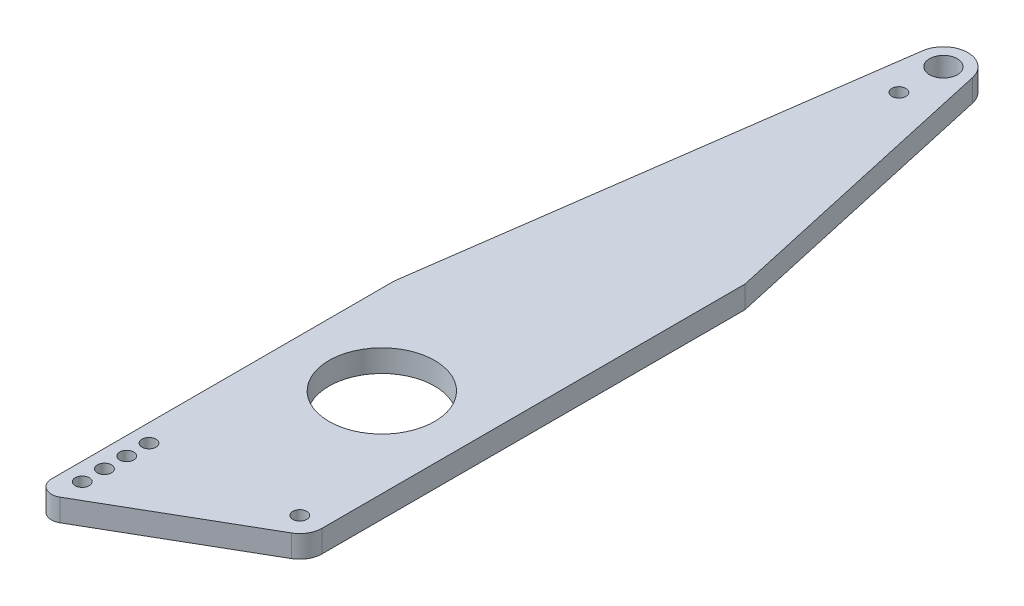
ISO-10303-21;
HEADER;
FILE_DESCRIPTION(('STEP AP214'),'2;1');
FILE_NAME('part.step','',(''),(''),'','','');
FILE_SCHEMA(('AUTOMOTIVE_DESIGN { 1 0 10303 214 1 1 1 1 }'));
ENDSEC;
DATA;
#1=APPLICATION_CONTEXT('core data for automotive mechanical design processes');
#2=APPLICATION_PROTOCOL_DEFINITION('international standard','automotive_design',2000,#1);
#3=PRODUCT_CONTEXT('',#1,'mechanical');
#4=PRODUCT('Part','Part','',(#3));
#5=PRODUCT_RELATED_PRODUCT_CATEGORY('part','',(#4));
#6=PRODUCT_DEFINITION_FORMATION('','',#4);
#7=PRODUCT_DEFINITION_CONTEXT('part definition',#1,'design');
#8=PRODUCT_DEFINITION('design','',#6,#7);
#9=PRODUCT_DEFINITION_SHAPE('','',#8);
#10=(LENGTH_UNIT() NAMED_UNIT(*) SI_UNIT(.MILLI.,.METRE.));
#11=(NAMED_UNIT(*) PLANE_ANGLE_UNIT() SI_UNIT($,.RADIAN.));
#12=(NAMED_UNIT(*) SI_UNIT($,.STERADIAN.) SOLID_ANGLE_UNIT());
#13=UNCERTAINTY_MEASURE_WITH_UNIT(LENGTH_MEASURE(1.E-05),#10,'distance_accuracy_value','');
#14=(GEOMETRIC_REPRESENTATION_CONTEXT(3) GLOBAL_UNCERTAINTY_ASSIGNED_CONTEXT((#13)) GLOBAL_UNIT_ASSIGNED_CONTEXT((#10,
#11,#12)) REPRESENTATION_CONTEXT('',''));
#15=CARTESIAN_POINT('',(0.,0.,0.));
#16=DIRECTION('',(0.,0.,1.));
#17=DIRECTION('',(1.,0.,0.));
#18=AXIS2_PLACEMENT_3D('',#15,#16,#17);
#19=CARTESIAN_POINT('',(-25.4,-6.35,229.105280097995));
#20=DIRECTION('',(-1.,0.,0.));
#21=DIRECTION('',(0.,0.,1.));
#22=AXIS2_PLACEMENT_3D('',#19,#20,#21);
#23=PLANE('',#22);
#24=DIRECTION('',(0.,0.,1.));
#25=VECTOR('',#24,1.);
#26=CARTESIAN_POINT('',(-25.4,-6.35,229.105280097995));
#27=LINE('',#26,#25);
#28=CARTESIAN_POINT('',(-25.4,-6.35,131.27869109805));
#29=VERTEX_POINT('',#28);
#30=CARTESIAN_POINT('',(-25.4,-6.35,197.355280097995));
#31=VERTEX_POINT('',#30);
#32=EDGE_CURVE('E128',#29,#31,#27,.T.);
#33=ORIENTED_EDGE('',*,*,#32,.T.);
#34=DIRECTION('',(0.,1.,0.));
#35=VECTOR('',#34,1.);
#36=CARTESIAN_POINT('',(-25.4,-6.35,197.355280097995));
#37=LINE('',#36,#35);
#38=CARTESIAN_POINT('',(-25.4,0.,197.355280097995));
#39=VERTEX_POINT('',#38);
#40=EDGE_CURVE('E11',#31,#39,#37,.T.);
#41=ORIENTED_EDGE('',*,*,#40,.T.);
#42=DIRECTION('',(0.,0.,1.));
#43=VECTOR('',#42,1.);
#44=CARTESIAN_POINT('',(-25.4,0.,229.105280097995));
#45=LINE('',#44,#43);
#46=CARTESIAN_POINT('',(-25.4,0.,131.27869109805));
#47=VERTEX_POINT('',#46);
#48=EDGE_CURVE('E159',#47,#39,#45,.T.);
#49=ORIENTED_EDGE('',*,*,#48,.F.);
#50=DIRECTION('',(0.,1.,0.));
#51=VECTOR('',#50,1.);
#52=CARTESIAN_POINT('',(-25.4,-6.35,131.27869109805));
#53=LINE('',#52,#51);
#54=EDGE_CURVE('E119',#29,#47,#53,.T.);
#55=ORIENTED_EDGE('',*,*,#54,.F.);
#56=EDGE_LOOP('',(#33,#41,#49,#55));
#57=FACE_BOUND('',#56,.T.);
#58=ADVANCED_FACE('F40',(#57),#23,.T.);
#59=CARTESIAN_POINT('',(-2.73922878190387E-13,-6.35,0.));
#60=DIRECTION('',(0.,1.,0.));
#61=DIRECTION('',(0.,0.,1.));
#62=AXIS2_PLACEMENT_3D('',#59,#60,#61);
#63=CYLINDRICAL_SURFACE('',#62,6.985);
#64=CARTESIAN_POINT('',(-2.73922878190387E-13,0.,0.));
#65=DIRECTION('',(0.,1.,0.));
#66=DIRECTION('',(0.,0.,1.));
#67=AXIS2_PLACEMENT_3D('',#64,#65,#66);
#68=CIRCLE('',#67,6.985);
#69=CARTESIAN_POINT('',(6.81842619825207,0.,-1.51634071995371));
#70=VERTEX_POINT('',#69);
#71=CARTESIAN_POINT('',(-6.9177677348346,0.,-0.966806375072736));
#72=VERTEX_POINT('',#71);
#73=EDGE_CURVE('E154',#70,#72,#68,.T.);
#74=ORIENTED_EDGE('',*,*,#73,.F.);
#75=DIRECTION('',(0.,1.,0.));
#76=VECTOR('',#75,1.);
#77=CARTESIAN_POINT('',(6.81842619825207,-6.35,-1.51634071995371));
#78=LINE('',#77,#76);
#79=CARTESIAN_POINT('',(6.81842619825207,-6.35,-1.51634071995371));
#80=VERTEX_POINT('',#79);
#81=EDGE_CURVE('E49',#80,#70,#78,.T.);
#82=ORIENTED_EDGE('',*,*,#81,.F.);
#83=CARTESIAN_POINT('',(-2.73922878190387E-13,-6.35,0.));
#84=DIRECTION('',(0.,1.,0.));
#85=DIRECTION('',(0.,0.,1.));
#86=AXIS2_PLACEMENT_3D('',#83,#84,#85);
#87=CIRCLE('',#86,6.985);
#88=CARTESIAN_POINT('',(-6.9177677348346,-6.35,-0.966806375072736));
#89=VERTEX_POINT('',#88);
#90=EDGE_CURVE('E126',#80,#89,#87,.T.);
#91=ORIENTED_EDGE('',*,*,#90,.T.);
#92=DIRECTION('',(0.,1.,0.));
#93=VECTOR('',#92,1.);
#94=CARTESIAN_POINT('',(-6.9177677348346,-6.35,-0.966806375072736));
#95=LINE('',#94,#93);
#96=EDGE_CURVE('E109',#89,#72,#95,.T.);
#97=ORIENTED_EDGE('',*,*,#96,.T.);
#98=EDGE_LOOP('',(#74,#82,#91,#97));
#99=FACE_BOUND('',#98,.T.);
#100=ADVANCED_FACE('F42',(#99),#63,.T.);
#101=CARTESIAN_POINT('',(25.4,-6.35,82.0381585738854));
#102=DIRECTION('',(0.976152641124134,0.,-0.2170852856054));
#103=DIRECTION('',(-0.2170852856054,0.,-0.976152641124134));
#104=AXIS2_PLACEMENT_3D('',#101,#102,#103);
#105=PLANE('',#104);
#106=DIRECTION('',(-0.2170852856054,0.,-0.976152641124134));
#107=VECTOR('',#106,1.);
#108=CARTESIAN_POINT('',(25.4,0.,82.0381585738854));
#109=LINE('',#108,#107);
#110=CARTESIAN_POINT('',(25.4,0.,82.0381585738854));
#111=VERTEX_POINT('',#110);
#112=EDGE_CURVE('E131',#111,#70,#109,.T.);
#113=ORIENTED_EDGE('',*,*,#112,.F.);
#114=DIRECTION('',(0.,1.,0.));
#115=VECTOR('',#114,1.);
#116=CARTESIAN_POINT('',(25.4,-6.35,82.0381585738854));
#117=LINE('',#116,#115);
#118=CARTESIAN_POINT('',(25.4,-6.35,82.0381585738854));
#119=VERTEX_POINT('',#118);
#120=EDGE_CURVE('E174',#119,#111,#117,.T.);
#121=ORIENTED_EDGE('',*,*,#120,.F.);
#122=DIRECTION('',(-0.2170852856054,0.,-0.976152641124134));
#123=VECTOR('',#122,1.);
#124=CARTESIAN_POINT('',(25.4,-6.35,82.0381585738854));
#125=LINE('',#124,#123);
#126=EDGE_CURVE('E120',#119,#80,#125,.T.);
#127=ORIENTED_EDGE('',*,*,#126,.T.);
#128=ORIENTED_EDGE('',*,*,#81,.T.);
#129=EDGE_LOOP('',(#113,#121,#127,#128));
#130=FACE_BOUND('',#129,.T.);
#131=ADVANCED_FACE('F190',(#130),#105,.T.);
#132=CARTESIAN_POINT('',(25.4,-6.35,82.0381585738854));
#133=DIRECTION('',(1.,0.,0.));
#134=DIRECTION('',(0.,0.,-1.));
#135=AXIS2_PLACEMENT_3D('',#132,#133,#134);
#136=PLANE('',#135);
#137=DIRECTION('',(0.,0.,-1.));
#138=VECTOR('',#137,1.);
#139=CARTESIAN_POINT('',(25.4,0.,82.0381585738854));
#140=LINE('',#139,#138);
#141=CARTESIAN_POINT('',(25.4,0.,202.708825790646));
#142=VERTEX_POINT('',#141);
#143=EDGE_CURVE('E134',#142,#111,#140,.T.);
#144=ORIENTED_EDGE('',*,*,#143,.F.);
#145=DIRECTION('',(0.,1.,0.));
#146=VECTOR('',#145,1.);
#147=CARTESIAN_POINT('',(25.4,-6.35,202.708825790646));
#148=LINE('',#147,#146);
#149=CARTESIAN_POINT('',(25.4,-6.35,202.708825790646));
#150=VERTEX_POINT('',#149);
#151=EDGE_CURVE('E176',#150,#142,#148,.T.);
#152=ORIENTED_EDGE('',*,*,#151,.F.);
#153=DIRECTION('',(0.,0.,-1.));
#154=VECTOR('',#153,1.);
#155=CARTESIAN_POINT('',(25.4,-6.35,82.0381585738854));
#156=LINE('',#155,#154);
#157=EDGE_CURVE('E150',#150,#119,#156,.T.);
#158=ORIENTED_EDGE('',*,*,#157,.T.);
#159=ORIENTED_EDGE('',*,*,#120,.T.);
#160=EDGE_LOOP('',(#144,#152,#158,#159));
#161=FACE_BOUND('',#160,.T.);
#162=ADVANCED_FACE('F221',(#161),#136,.T.);
#163=CARTESIAN_POINT('',(19.05,-6.35,202.708825790646));
#164=DIRECTION('',(0.,1.,0.));
#165=DIRECTION('',(0.,0.,1.));
#166=AXIS2_PLACEMENT_3D('',#163,#164,#165);
#167=CYLINDRICAL_SURFACE('',#166,6.34999999999999);
#168=CARTESIAN_POINT('',(19.05,0.,202.708825790646));
#169=DIRECTION('',(0.,1.,0.));
#170=DIRECTION('',(0.,0.,-1.));
#171=AXIS2_PLACEMENT_3D('',#168,#169,#170);
#172=CIRCLE('',#171,6.34999999999999);
#173=CARTESIAN_POINT('',(22.225,0.,208.208087104677));
#174=VERTEX_POINT('',#173);
#175=EDGE_CURVE('E168',#174,#142,#172,.T.);
#176=ORIENTED_EDGE('',*,*,#175,.F.);
#177=DIRECTION('',(0.,1.,0.));
#178=VECTOR('',#177,1.);
#179=CARTESIAN_POINT('',(22.225,-6.35,208.208087104677));
#180=LINE('',#179,#178);
#181=CARTESIAN_POINT('',(22.225,-6.35,208.208087104677));
#182=VERTEX_POINT('',#181);
#183=EDGE_CURVE('E178',#182,#174,#180,.T.);
#184=ORIENTED_EDGE('',*,*,#183,.F.);
#185=CARTESIAN_POINT('',(19.05,-6.35,202.708825790646));
#186=DIRECTION('',(0.,1.,0.));
#187=DIRECTION('',(0.,0.,-1.));
#188=AXIS2_PLACEMENT_3D('',#185,#186,#187);
#189=CIRCLE('',#188,6.34999999999999);
#190=EDGE_CURVE('E147',#182,#150,#189,.T.);
#191=ORIENTED_EDGE('',*,*,#190,.T.);
#192=ORIENTED_EDGE('',*,*,#151,.T.);
#193=EDGE_LOOP('',(#176,#184,#191,#192));
#194=FACE_BOUND('',#193,.T.);
#195=ADVANCED_FACE('F197',(#194),#167,.T.);
#196=CARTESIAN_POINT('',(22.225,-6.35,208.208087104677));
#197=DIRECTION('',(0.499999999999997,0.,0.86602540378444));
#198=DIRECTION('',(0.86602540378444,0.,-0.499999999999998));
#199=AXIS2_PLACEMENT_3D('',#196,#197,#198);
#200=PLANE('',#199);
#201=DIRECTION('',(0.86602540378444,0.,-0.499999999999997));
#202=VECTOR('',#201,1.);
#203=CARTESIAN_POINT('',(22.225,0.,208.208087104677));
#204=LINE('',#203,#202);
#205=CARTESIAN_POINT('',(-19.685,0.,232.404836886414));
#206=VERTEX_POINT('',#205);
#207=EDGE_CURVE('E165',#206,#174,#204,.T.);
#208=ORIENTED_EDGE('',*,*,#207,.F.);
#209=DIRECTION('',(0.,1.,0.));
#210=VECTOR('',#209,1.);
#211=CARTESIAN_POINT('',(-19.685,-6.35,232.404836886414));
#212=LINE('',#211,#210);
#213=CARTESIAN_POINT('',(-19.685,-6.35,232.404836886414));
#214=VERTEX_POINT('',#213);
#215=EDGE_CURVE('E180',#214,#206,#212,.T.);
#216=ORIENTED_EDGE('',*,*,#215,.F.);
#217=DIRECTION('',(0.86602540378444,0.,-0.499999999999997));
#218=VECTOR('',#217,1.);
#219=CARTESIAN_POINT('',(22.225,-6.35,208.208087104677));
#220=LINE('',#219,#218);
#221=EDGE_CURVE('E144',#214,#182,#220,.T.);
#222=ORIENTED_EDGE('',*,*,#221,.T.);
#223=ORIENTED_EDGE('',*,*,#183,.T.);
#224=EDGE_LOOP('',(#208,#216,#222,#223));
#225=FACE_BOUND('',#224,.T.);
#226=ADVANCED_FACE('F200',(#225),#200,.T.);
#227=CARTESIAN_POINT('',(-21.59,-6.35,229.105280097995));
#228=DIRECTION('',(0.,1.,0.));
#229=DIRECTION('',(0.,0.,1.));
#230=AXIS2_PLACEMENT_3D('',#227,#228,#229);
#231=CYLINDRICAL_SURFACE('',#230,3.80999999999998);
#232=CARTESIAN_POINT('',(-21.59,0.,229.105280097995));
#233=DIRECTION('',(0.,1.,0.));
#234=DIRECTION('',(0.,0.,1.));
#235=AXIS2_PLACEMENT_3D('',#232,#233,#234);
#236=CIRCLE('',#235,3.80999999999998);
#237=CARTESIAN_POINT('',(-25.4,0.,229.105280097995));
#238=VERTEX_POINT('',#237);
#239=EDGE_CURVE('E162',#238,#206,#236,.T.);
#240=ORIENTED_EDGE('',*,*,#239,.F.);
#241=DIRECTION('',(0.,1.,0.));
#242=VECTOR('',#241,1.);
#243=CARTESIAN_POINT('',(-25.4,-6.35,229.105280097995));
#244=LINE('',#243,#242);
#245=CARTESIAN_POINT('',(-25.4,-6.35,229.105280097995));
#246=VERTEX_POINT('',#245);
#247=EDGE_CURVE('E182',#246,#238,#244,.T.);
#248=ORIENTED_EDGE('',*,*,#247,.F.);
#249=CARTESIAN_POINT('',(-21.59,-6.35,229.105280097995));
#250=DIRECTION('',(0.,1.,0.));
#251=DIRECTION('',(0.,0.,1.));
#252=AXIS2_PLACEMENT_3D('',#249,#250,#251);
#253=CIRCLE('',#252,3.80999999999998);
#254=EDGE_CURVE('E141',#246,#214,#253,.T.);
#255=ORIENTED_EDGE('',*,*,#254,.T.);
#256=ORIENTED_EDGE('',*,*,#215,.T.);
#257=EDGE_LOOP('',(#240,#248,#255,#256));
#258=FACE_BOUND('',#257,.T.);
#259=ADVANCED_FACE('F205',(#258),#231,.T.);
#260=ORIENTED_EDGE('',*,*,#40,.F.);
#261=EDGE_CURVE('E129',#31,#246,#27,.T.);
#262=ORIENTED_EDGE('',*,*,#261,.T.);
#263=ORIENTED_EDGE('',*,*,#247,.T.);
#264=EDGE_CURVE('E158',#39,#238,#45,.T.);
#265=ORIENTED_EDGE('',*,*,#264,.F.);
#266=EDGE_LOOP('',(#260,#262,#263,#265));
#267=FACE_BOUND('',#266,.T.);
#268=ADVANCED_FACE('F206',(#267),#23,.T.);
#269=CARTESIAN_POINT('',(-25.4,-6.35,131.27869109805));
#270=DIRECTION('',(-0.990374765187488,0.,-0.138411793138545));
#271=DIRECTION('',(-0.138411793138545,0.,0.990374765187488));
#272=AXIS2_PLACEMENT_3D('',#269,#270,#271);
#273=PLANE('',#272);
#274=DIRECTION('',(-0.138411793138545,0.,0.990374765187488));
#275=VECTOR('',#274,1.);
#276=CARTESIAN_POINT('',(-25.4,0.,131.27869109805));
#277=LINE('',#276,#275);
#278=EDGE_CURVE('E114',#72,#47,#277,.T.);
#279=ORIENTED_EDGE('',*,*,#278,.F.);
#280=ORIENTED_EDGE('',*,*,#96,.F.);
#281=DIRECTION('',(-0.138411793138545,0.,0.990374765187488));
#282=VECTOR('',#281,1.);
#283=CARTESIAN_POINT('',(-25.4,-6.35,131.27869109805));
#284=LINE('',#283,#282);
#285=EDGE_CURVE('E112',#89,#29,#284,.T.);
#286=ORIENTED_EDGE('',*,*,#285,.T.);
#287=ORIENTED_EDGE('',*,*,#54,.T.);
#288=EDGE_LOOP('',(#279,#280,#286,#287));
#289=FACE_BOUND('',#288,.T.);
#290=ADVANCED_FACE('F111',(#289),#273,.T.);
#291=CARTESIAN_POINT('',(-2.73922878190387E-13,-6.35,0.));
#292=DIRECTION('',(0.,1.,0.));
#293=DIRECTION('',(0.,0.,1.));
#294=AXIS2_PLACEMENT_3D('',#291,#292,#293);
#295=PLANE('',#294);
#296=CARTESIAN_POINT('',(0.,-6.35,12.7));
#297=DIRECTION('',(0.,1.,0.));
#298=DIRECTION('',(0.,0.,1.));
#299=AXIS2_PLACEMENT_3D('',#296,#297,#298);
#300=CIRCLE('',#299,2.00000000000026);
#301=CARTESIAN_POINT('',(0.,-6.35,14.7000000000002));
#302=VERTEX_POINT('',#301);
#303=EDGE_CURVE('E414',#302,#302,#300,.T.);
#304=ORIENTED_EDGE('',*,*,#303,.T.);
#305=EDGE_LOOP('',(#304));
#306=FACE_BOUND('',#305,.T.);
#307=CARTESIAN_POINT('',(19.05,-6.35,202.708825790646));
#308=DIRECTION('',(0.,1.,0.));
#309=DIRECTION('',(0.,0.,1.));
#310=AXIS2_PLACEMENT_3D('',#307,#308,#309);
#311=CIRCLE('',#310,2.);
#312=CARTESIAN_POINT('',(19.05,-6.35,204.708825790646));
#313=VERTEX_POINT('',#312);
#314=EDGE_CURVE('E410',#313,#313,#311,.T.);
#315=ORIENTED_EDGE('',*,*,#314,.T.);
#316=EDGE_LOOP('',(#315));
#317=FACE_BOUND('',#316,.T.);
#318=CARTESIAN_POINT('',(-20.32,-6.35,206.375));
#319=DIRECTION('',(0.,1.,0.));
#320=DIRECTION('',(0.,0.,1.));
#321=AXIS2_PLACEMENT_3D('',#318,#319,#320);
#322=CIRCLE('',#321,2.00000000000023);
#323=CARTESIAN_POINT('',(-20.32,-6.35,208.375));
#324=VERTEX_POINT('',#323);
#325=EDGE_CURVE('E406',#324,#324,#322,.T.);
#326=ORIENTED_EDGE('',*,*,#325,.T.);
#327=EDGE_LOOP('',(#326));
#328=FACE_BOUND('',#327,.T.);
#329=CARTESIAN_POINT('',(-20.32,-6.35,212.725));
#330=DIRECTION('',(0.,1.,0.));
#331=DIRECTION('',(0.,0.,1.));
#332=AXIS2_PLACEMENT_3D('',#329,#330,#331);
#333=CIRCLE('',#332,2.00000000000023);
#334=CARTESIAN_POINT('',(-20.32,-6.35,214.725));
#335=VERTEX_POINT('',#334);
#336=EDGE_CURVE('E402',#335,#335,#333,.T.);
#337=ORIENTED_EDGE('',*,*,#336,.T.);
#338=EDGE_LOOP('',(#337));
#339=FACE_BOUND('',#338,.T.);
#340=CARTESIAN_POINT('',(-20.32,-6.35,225.425));
#341=DIRECTION('',(0.,1.,0.));
#342=DIRECTION('',(0.,0.,1.));
#343=AXIS2_PLACEMENT_3D('',#340,#341,#342);
#344=CIRCLE('',#343,2.00000000000023);
#345=CARTESIAN_POINT('',(-20.32,-6.35,227.425));
#346=VERTEX_POINT('',#345);
#347=EDGE_CURVE('E398',#346,#346,#344,.T.);
#348=ORIENTED_EDGE('',*,*,#347,.T.);
#349=EDGE_LOOP('',(#348));
#350=FACE_BOUND('',#349,.T.);
#351=CARTESIAN_POINT('',(0.,-6.35,160.246508934012));
#352=DIRECTION('',(0.,1.,0.));
#353=DIRECTION('',(0.,0.,1.));
#354=AXIS2_PLACEMENT_3D('',#351,#352,#353);
#355=CIRCLE('',#354,15.0812500000002);
#356=CARTESIAN_POINT('',(0.,-6.35,175.327758934012));
#357=VERTEX_POINT('',#356);
#358=EDGE_CURVE('E394',#357,#357,#355,.T.);
#359=ORIENTED_EDGE('',*,*,#358,.T.);
#360=EDGE_LOOP('',(#359));
#361=FACE_BOUND('',#360,.T.);
#362=CARTESIAN_POINT('',(-20.32,-6.35,219.075));
#363=DIRECTION('',(0.,1.,0.));
#364=DIRECTION('',(0.,0.,1.));
#365=AXIS2_PLACEMENT_3D('',#362,#363,#364);
#366=CIRCLE('',#365,2.00000000000023);
#367=CARTESIAN_POINT('',(-20.32,-6.35,221.075));
#368=VERTEX_POINT('',#367);
#369=EDGE_CURVE('E388',#368,#368,#366,.T.);
#370=ORIENTED_EDGE('',*,*,#369,.T.);
#371=EDGE_LOOP('',(#370));
#372=FACE_BOUND('',#371,.T.);
#373=CARTESIAN_POINT('',(-2.73922878190387E-13,-6.35,0.));
#374=DIRECTION('',(0.,1.,0.));
#375=DIRECTION('',(0.,0.,1.));
#376=AXIS2_PLACEMENT_3D('',#373,#374,#375);
#377=CIRCLE('',#376,3.96875);
#378=CARTESIAN_POINT('',(-2.73922878190387E-13,-6.35,3.96874999999999));
#379=VERTEX_POINT('',#378);
#380=EDGE_CURVE('E156',#379,#379,#377,.T.);
#381=ORIENTED_EDGE('',*,*,#380,.T.);
#382=EDGE_LOOP('',(#381));
#383=FACE_BOUND('',#382,.T.);
#384=ORIENTED_EDGE('',*,*,#90,.F.);
#385=ORIENTED_EDGE('',*,*,#126,.F.);
#386=ORIENTED_EDGE('',*,*,#157,.F.);
#387=ORIENTED_EDGE('',*,*,#190,.F.);
#388=ORIENTED_EDGE('',*,*,#221,.F.);
#389=ORIENTED_EDGE('',*,*,#254,.F.);
#390=ORIENTED_EDGE('',*,*,#261,.F.);
#391=ORIENTED_EDGE('',*,*,#32,.F.);
#392=ORIENTED_EDGE('',*,*,#285,.F.);
#393=EDGE_LOOP('',(#384,#385,#386,#387,#388,#389,#390,#391,#392));
#394=FACE_BOUND('',#393,.T.);
#395=ADVANCED_FACE('F124',(#306,#317,#328,#339,#350,#361,#372,#383,#394),#295,.F.);
#396=CARTESIAN_POINT('',(-2.73922878190387E-13,0.,0.));
#397=DIRECTION('',(0.,1.,0.));
#398=DIRECTION('',(0.,0.,1.));
#399=AXIS2_PLACEMENT_3D('',#396,#397,#398);
#400=PLANE('',#399);
#401=CARTESIAN_POINT('',(0.,0.,12.7));
#402=DIRECTION('',(0.,1.,0.));
#403=DIRECTION('',(0.,0.,1.));
#404=AXIS2_PLACEMENT_3D('',#401,#402,#403);
#405=CIRCLE('',#404,2.00000000000026);
#406=CARTESIAN_POINT('',(0.,0.,14.7000000000002));
#407=VERTEX_POINT('',#406);
#408=EDGE_CURVE('E360',#407,#407,#405,.T.);
#409=ORIENTED_EDGE('',*,*,#408,.F.);
#410=EDGE_LOOP('',(#409));
#411=FACE_BOUND('',#410,.T.);
#412=CARTESIAN_POINT('',(19.05,0.,202.708825790646));
#413=DIRECTION('',(0.,1.,0.));
#414=DIRECTION('',(0.,0.,1.));
#415=AXIS2_PLACEMENT_3D('',#412,#413,#414);
#416=CIRCLE('',#415,2.);
#417=CARTESIAN_POINT('',(19.05,0.,204.708825790646));
#418=VERTEX_POINT('',#417);
#419=EDGE_CURVE('E364',#418,#418,#416,.T.);
#420=ORIENTED_EDGE('',*,*,#419,.F.);
#421=EDGE_LOOP('',(#420));
#422=FACE_BOUND('',#421,.T.);
#423=CARTESIAN_POINT('',(-20.32,0.,206.375));
#424=DIRECTION('',(0.,1.,0.));
#425=DIRECTION('',(0.,0.,1.));
#426=AXIS2_PLACEMENT_3D('',#423,#424,#425);
#427=CIRCLE('',#426,2.00000000000023);
#428=CARTESIAN_POINT('',(-20.32,0.,208.375));
#429=VERTEX_POINT('',#428);
#430=EDGE_CURVE('E368',#429,#429,#427,.T.);
#431=ORIENTED_EDGE('',*,*,#430,.F.);
#432=EDGE_LOOP('',(#431));
#433=FACE_BOUND('',#432,.T.);
#434=CARTESIAN_POINT('',(-20.32,0.,212.725));
#435=DIRECTION('',(0.,1.,0.));
#436=DIRECTION('',(0.,0.,1.));
#437=AXIS2_PLACEMENT_3D('',#434,#435,#436);
#438=CIRCLE('',#437,2.00000000000023);
#439=CARTESIAN_POINT('',(-20.32,0.,214.725));
#440=VERTEX_POINT('',#439);
#441=EDGE_CURVE('E372',#440,#440,#438,.T.);
#442=ORIENTED_EDGE('',*,*,#441,.F.);
#443=EDGE_LOOP('',(#442));
#444=FACE_BOUND('',#443,.T.);
#445=CARTESIAN_POINT('',(-20.32,0.,225.425));
#446=DIRECTION('',(0.,1.,0.));
#447=DIRECTION('',(0.,0.,1.));
#448=AXIS2_PLACEMENT_3D('',#445,#446,#447);
#449=CIRCLE('',#448,2.00000000000023);
#450=CARTESIAN_POINT('',(-20.32,0.,227.425));
#451=VERTEX_POINT('',#450);
#452=EDGE_CURVE('E376',#451,#451,#449,.T.);
#453=ORIENTED_EDGE('',*,*,#452,.F.);
#454=EDGE_LOOP('',(#453));
#455=FACE_BOUND('',#454,.T.);
#456=CARTESIAN_POINT('',(0.,0.,160.246508934012));
#457=DIRECTION('',(0.,1.,0.));
#458=DIRECTION('',(0.,0.,1.));
#459=AXIS2_PLACEMENT_3D('',#456,#457,#458);
#460=CIRCLE('',#459,15.0812500000002);
#461=CARTESIAN_POINT('',(0.,0.,175.327758934012));
#462=VERTEX_POINT('',#461);
#463=EDGE_CURVE('E380',#462,#462,#460,.T.);
#464=ORIENTED_EDGE('',*,*,#463,.F.);
#465=EDGE_LOOP('',(#464));
#466=FACE_BOUND('',#465,.T.);
#467=CARTESIAN_POINT('',(-20.32,0.,219.075));
#468=DIRECTION('',(0.,1.,0.));
#469=DIRECTION('',(0.,0.,1.));
#470=AXIS2_PLACEMENT_3D('',#467,#468,#469);
#471=CIRCLE('',#470,2.00000000000023);
#472=CARTESIAN_POINT('',(-20.32,0.,221.075));
#473=VERTEX_POINT('',#472);
#474=EDGE_CURVE('E384',#473,#473,#471,.T.);
#475=ORIENTED_EDGE('',*,*,#474,.F.);
#476=EDGE_LOOP('',(#475));
#477=FACE_BOUND('',#476,.T.);
#478=CARTESIAN_POINT('',(-2.73922878190387E-13,0.,0.));
#479=DIRECTION('',(0.,1.,0.));
#480=DIRECTION('',(0.,0.,1.));
#481=AXIS2_PLACEMENT_3D('',#478,#479,#480);
#482=CIRCLE('',#481,3.96875);
#483=CARTESIAN_POINT('',(-2.73922878190387E-13,0.,3.96874999999999));
#484=VERTEX_POINT('',#483);
#485=EDGE_CURVE('E137',#484,#484,#482,.T.);
#486=ORIENTED_EDGE('',*,*,#485,.F.);
#487=EDGE_LOOP('',(#486));
#488=FACE_BOUND('',#487,.T.);
#489=ORIENTED_EDGE('',*,*,#73,.T.);
#490=ORIENTED_EDGE('',*,*,#278,.T.);
#491=ORIENTED_EDGE('',*,*,#48,.T.);
#492=ORIENTED_EDGE('',*,*,#264,.T.);
#493=ORIENTED_EDGE('',*,*,#239,.T.);
#494=ORIENTED_EDGE('',*,*,#207,.T.);
#495=ORIENTED_EDGE('',*,*,#175,.T.);
#496=ORIENTED_EDGE('',*,*,#143,.T.);
#497=ORIENTED_EDGE('',*,*,#112,.T.);
#498=EDGE_LOOP('',(#489,#490,#491,#492,#493,#494,#495,#496,#497));
#499=FACE_BOUND('',#498,.T.);
#500=ADVANCED_FACE('F186',(#411,#422,#433,#444,#455,#466,#477,#488,#499),#400,.T.);
#501=CARTESIAN_POINT('',(-2.73922878190387E-13,-6.35,0.));
#502=DIRECTION('',(0.,1.,0.));
#503=DIRECTION('',(0.,0.,1.));
#504=AXIS2_PLACEMENT_3D('',#501,#502,#503);
#505=CYLINDRICAL_SURFACE('',#504,3.96875);
#506=ORIENTED_EDGE('',*,*,#380,.F.);
#507=EDGE_LOOP('',(#506));
#508=FACE_BOUND('',#507,.T.);
#509=ORIENTED_EDGE('',*,*,#485,.T.);
#510=EDGE_LOOP('',(#509));
#511=FACE_BOUND('',#510,.T.);
#512=ADVANCED_FACE('F254',(#508,#511),#505,.F.);
#513=CARTESIAN_POINT('',(-20.32,-6.35,219.075));
#514=DIRECTION('',(0.,1.,0.));
#515=DIRECTION('',(0.,0.,1.));
#516=AXIS2_PLACEMENT_3D('',#513,#514,#515);
#517=CYLINDRICAL_SURFACE('',#516,2.00000000000023);
#518=ORIENTED_EDGE('',*,*,#369,.F.);
#519=EDGE_LOOP('',(#518));
#520=FACE_BOUND('',#519,.T.);
#521=ORIENTED_EDGE('',*,*,#474,.T.);
#522=EDGE_LOOP('',(#521));
#523=FACE_BOUND('',#522,.T.);
#524=ADVANCED_FACE('F259',(#520,#523),#517,.F.);
#525=CARTESIAN_POINT('',(0.,-6.35,160.246508934012));
#526=DIRECTION('',(0.,1.,0.));
#527=DIRECTION('',(0.,0.,1.));
#528=AXIS2_PLACEMENT_3D('',#525,#526,#527);
#529=CYLINDRICAL_SURFACE('',#528,15.0812500000002);
#530=ORIENTED_EDGE('',*,*,#358,.F.);
#531=EDGE_LOOP('',(#530));
#532=FACE_BOUND('',#531,.T.);
#533=ORIENTED_EDGE('',*,*,#463,.T.);
#534=EDGE_LOOP('',(#533));
#535=FACE_BOUND('',#534,.T.);
#536=ADVANCED_FACE('F271',(#532,#535),#529,.F.);
#537=CARTESIAN_POINT('',(-20.32,-6.35,225.425));
#538=DIRECTION('',(0.,1.,0.));
#539=DIRECTION('',(0.,0.,1.));
#540=AXIS2_PLACEMENT_3D('',#537,#538,#539);
#541=CYLINDRICAL_SURFACE('',#540,2.00000000000023);
#542=ORIENTED_EDGE('',*,*,#347,.F.);
#543=EDGE_LOOP('',(#542));
#544=FACE_BOUND('',#543,.T.);
#545=ORIENTED_EDGE('',*,*,#452,.T.);
#546=EDGE_LOOP('',(#545));
#547=FACE_BOUND('',#546,.T.);
#548=ADVANCED_FACE('F281',(#544,#547),#541,.F.);
#549=CARTESIAN_POINT('',(-20.32,-6.35,212.725));
#550=DIRECTION('',(0.,1.,0.));
#551=DIRECTION('',(0.,0.,1.));
#552=AXIS2_PLACEMENT_3D('',#549,#550,#551);
#553=CYLINDRICAL_SURFACE('',#552,2.00000000000023);
#554=ORIENTED_EDGE('',*,*,#336,.F.);
#555=EDGE_LOOP('',(#554));
#556=FACE_BOUND('',#555,.T.);
#557=ORIENTED_EDGE('',*,*,#441,.T.);
#558=EDGE_LOOP('',(#557));
#559=FACE_BOUND('',#558,.T.);
#560=ADVANCED_FACE('F291',(#556,#559),#553,.F.);
#561=CARTESIAN_POINT('',(-20.32,-6.35,206.375));
#562=DIRECTION('',(0.,1.,0.));
#563=DIRECTION('',(0.,0.,1.));
#564=AXIS2_PLACEMENT_3D('',#561,#562,#563);
#565=CYLINDRICAL_SURFACE('',#564,2.00000000000023);
#566=ORIENTED_EDGE('',*,*,#325,.F.);
#567=EDGE_LOOP('',(#566));
#568=FACE_BOUND('',#567,.T.);
#569=ORIENTED_EDGE('',*,*,#430,.T.);
#570=EDGE_LOOP('',(#569));
#571=FACE_BOUND('',#570,.T.);
#572=ADVANCED_FACE('F301',(#568,#571),#565,.F.);
#573=CARTESIAN_POINT('',(19.05,-6.35,202.708825790646));
#574=DIRECTION('',(0.,1.,0.));
#575=DIRECTION('',(0.,0.,1.));
#576=AXIS2_PLACEMENT_3D('',#573,#574,#575);
#577=CYLINDRICAL_SURFACE('',#576,2.);
#578=ORIENTED_EDGE('',*,*,#314,.F.);
#579=EDGE_LOOP('',(#578));
#580=FACE_BOUND('',#579,.T.);
#581=ORIENTED_EDGE('',*,*,#419,.T.);
#582=EDGE_LOOP('',(#581));
#583=FACE_BOUND('',#582,.T.);
#584=ADVANCED_FACE('F311',(#580,#583),#577,.F.);
#585=CARTESIAN_POINT('',(0.,-6.35,12.7));
#586=DIRECTION('',(0.,1.,0.));
#587=DIRECTION('',(0.,0.,1.));
#588=AXIS2_PLACEMENT_3D('',#585,#586,#587);
#589=CYLINDRICAL_SURFACE('',#588,2.00000000000026);
#590=ORIENTED_EDGE('',*,*,#303,.F.);
#591=EDGE_LOOP('',(#590));
#592=FACE_BOUND('',#591,.T.);
#593=ORIENTED_EDGE('',*,*,#408,.T.);
#594=EDGE_LOOP('',(#593));
#595=FACE_BOUND('',#594,.T.);
#596=ADVANCED_FACE('F321',(#592,#595),#589,.F.);
#597=CLOSED_SHELL('',(#58,#100,#131,#162,#195,#226,#259,#268,#290,#395,#500,#512,#524,#536,#548,
#560,#572,#584,#596));
#598=MANIFOLD_SOLID_BREP('B2',#597);
#599=ADVANCED_BREP_SHAPE_REPRESENTATION('',(#18,#598),#14);
#600=SHAPE_DEFINITION_REPRESENTATION(#9,#599);
ENDSEC;
END-ISO-10303-21;
